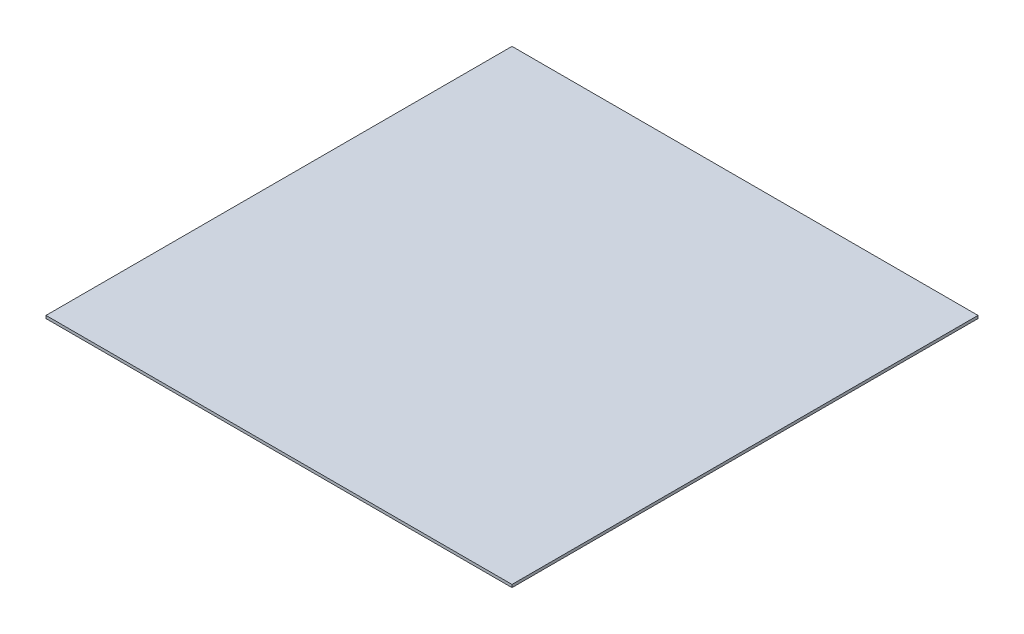
ISO-10303-21;
HEADER;
FILE_DESCRIPTION(('STEP AP214'),'2;1');
FILE_NAME('part.step','',(''),(''),'','','');
FILE_SCHEMA(('AUTOMOTIVE_DESIGN { 1 0 10303 214 1 1 1 1 }'));
ENDSEC;
DATA;
#1=APPLICATION_CONTEXT('core data for automotive mechanical design processes');
#2=APPLICATION_PROTOCOL_DEFINITION('international standard','automotive_design',2000,#1);
#3=PRODUCT_CONTEXT('',#1,'mechanical');
#4=PRODUCT('Part','Part','',(#3));
#5=PRODUCT_RELATED_PRODUCT_CATEGORY('part','',(#4));
#6=PRODUCT_DEFINITION_FORMATION('','',#4);
#7=PRODUCT_DEFINITION_CONTEXT('part definition',#1,'design');
#8=PRODUCT_DEFINITION('design','',#6,#7);
#9=PRODUCT_DEFINITION_SHAPE('','',#8);
#10=(LENGTH_UNIT() NAMED_UNIT(*) SI_UNIT(.MILLI.,.METRE.));
#11=(NAMED_UNIT(*) PLANE_ANGLE_UNIT() SI_UNIT($,.RADIAN.));
#12=(NAMED_UNIT(*) SI_UNIT($,.STERADIAN.) SOLID_ANGLE_UNIT());
#13=UNCERTAINTY_MEASURE_WITH_UNIT(LENGTH_MEASURE(1.E-05),#10,'distance_accuracy_value','');
#14=(GEOMETRIC_REPRESENTATION_CONTEXT(3) GLOBAL_UNCERTAINTY_ASSIGNED_CONTEXT((#13)) GLOBAL_UNIT_ASSIGNED_CONTEXT((#10,
#11,#12)) REPRESENTATION_CONTEXT('',''));
#15=CARTESIAN_POINT('',(0.,0.,0.));
#16=DIRECTION('',(0.,0.,1.));
#17=DIRECTION('',(1.,0.,0.));
#18=AXIS2_PLACEMENT_3D('',#15,#16,#17);
#19=CARTESIAN_POINT('',(0.,2.9972,0.));
#20=DIRECTION('',(1.,0.,0.));
#21=DIRECTION('',(0.,0.,-1.));
#22=AXIS2_PLACEMENT_3D('',#19,#20,#21);
#23=PLANE('',#22);
#24=DIRECTION('',(0.,0.,1.));
#25=VECTOR('',#24,1.);
#26=CARTESIAN_POINT('',(0.,0.,0.));
#27=LINE('',#26,#25);
#28=CARTESIAN_POINT('',(0.,0.,0.));
#29=VERTEX_POINT('',#28);
#30=CARTESIAN_POINT('',(0.,0.,500.));
#31=VERTEX_POINT('',#30);
#32=EDGE_CURVE('E96',#29,#31,#27,.T.);
#33=ORIENTED_EDGE('',*,*,#32,.T.);
#34=DIRECTION('',(0.,-1.,0.));
#35=VECTOR('',#34,1.);
#36=CARTESIAN_POINT('',(0.,2.9972,500.));
#37=LINE('',#36,#35);
#38=CARTESIAN_POINT('',(0.,2.9972,500.));
#39=VERTEX_POINT('',#38);
#40=EDGE_CURVE('E11',#39,#31,#37,.T.);
#41=ORIENTED_EDGE('',*,*,#40,.F.);
#42=DIRECTION('',(0.,0.,1.));
#43=VECTOR('',#42,1.);
#44=CARTESIAN_POINT('',(0.,2.9972,0.));
#45=LINE('',#44,#43);
#46=CARTESIAN_POINT('',(0.,2.9972,0.));
#47=VERTEX_POINT('',#46);
#48=EDGE_CURVE('E84',#47,#39,#45,.T.);
#49=ORIENTED_EDGE('',*,*,#48,.F.);
#50=DIRECTION('',(0.,-1.,0.));
#51=VECTOR('',#50,1.);
#52=CARTESIAN_POINT('',(0.,2.9972,0.));
#53=LINE('',#52,#51);
#54=EDGE_CURVE('E92',#47,#29,#53,.T.);
#55=ORIENTED_EDGE('',*,*,#54,.T.);
#56=EDGE_LOOP('',(#33,#41,#49,#55));
#57=FACE_BOUND('',#56,.T.);
#58=ADVANCED_FACE('F33',(#57),#23,.F.);
#59=CARTESIAN_POINT('',(0.,2.9972,500.));
#60=DIRECTION('',(0.,0.,-1.));
#61=DIRECTION('',(-1.,0.,0.));
#62=AXIS2_PLACEMENT_3D('',#59,#60,#61);
#63=PLANE('',#62);
#64=DIRECTION('',(1.,0.,0.));
#65=VECTOR('',#64,1.);
#66=CARTESIAN_POINT('',(0.,0.,500.));
#67=LINE('',#66,#65);
#68=CARTESIAN_POINT('',(500.,0.,500.));
#69=VERTEX_POINT('',#68);
#70=EDGE_CURVE('E88',#31,#69,#67,.T.);
#71=ORIENTED_EDGE('',*,*,#70,.T.);
#72=DIRECTION('',(0.,-1.,0.));
#73=VECTOR('',#72,1.);
#74=CARTESIAN_POINT('',(500.,2.9972,500.));
#75=LINE('',#74,#73);
#76=CARTESIAN_POINT('',(500.,2.9972,500.));
#77=VERTEX_POINT('',#76);
#78=EDGE_CURVE('E41',#77,#69,#75,.T.);
#79=ORIENTED_EDGE('',*,*,#78,.F.);
#80=DIRECTION('',(1.,0.,0.));
#81=VECTOR('',#80,1.);
#82=CARTESIAN_POINT('',(0.,2.9972,500.));
#83=LINE('',#82,#81);
#84=EDGE_CURVE('E79',#39,#77,#83,.T.);
#85=ORIENTED_EDGE('',*,*,#84,.F.);
#86=ORIENTED_EDGE('',*,*,#40,.T.);
#87=EDGE_LOOP('',(#71,#79,#85,#86));
#88=FACE_BOUND('',#87,.T.);
#89=ADVANCED_FACE('F87',(#88),#63,.F.);
#90=CARTESIAN_POINT('',(500.,2.9972,0.));
#91=DIRECTION('',(-1.,0.,0.));
#92=DIRECTION('',(0.,0.,1.));
#93=AXIS2_PLACEMENT_3D('',#90,#91,#92);
#94=PLANE('',#93);
#95=DIRECTION('',(0.,0.,-1.));
#96=VECTOR('',#95,1.);
#97=CARTESIAN_POINT('',(500.,0.,0.));
#98=LINE('',#97,#96);
#99=CARTESIAN_POINT('',(500.,0.,0.));
#100=VERTEX_POINT('',#99);
#101=EDGE_CURVE('E66',#69,#100,#98,.T.);
#102=ORIENTED_EDGE('',*,*,#101,.T.);
#103=DIRECTION('',(0.,-1.,0.));
#104=VECTOR('',#103,1.);
#105=CARTESIAN_POINT('',(500.,2.9972,0.));
#106=LINE('',#105,#104);
#107=CARTESIAN_POINT('',(500.,2.9972,0.));
#108=VERTEX_POINT('',#107);
#109=EDGE_CURVE('E89',#108,#100,#106,.T.);
#110=ORIENTED_EDGE('',*,*,#109,.F.);
#111=DIRECTION('',(0.,0.,-1.));
#112=VECTOR('',#111,1.);
#113=CARTESIAN_POINT('',(500.,2.9972,0.));
#114=LINE('',#113,#112);
#115=EDGE_CURVE('E82',#77,#108,#114,.T.);
#116=ORIENTED_EDGE('',*,*,#115,.F.);
#117=ORIENTED_EDGE('',*,*,#78,.T.);
#118=EDGE_LOOP('',(#102,#110,#116,#117));
#119=FACE_BOUND('',#118,.T.);
#120=ADVANCED_FACE('F90',(#119),#94,.F.);
#121=CARTESIAN_POINT('',(0.,2.9972,0.));
#122=DIRECTION('',(0.,0.,1.));
#123=DIRECTION('',(1.,0.,0.));
#124=AXIS2_PLACEMENT_3D('',#121,#122,#123);
#125=PLANE('',#124);
#126=DIRECTION('',(-1.,0.,0.));
#127=VECTOR('',#126,1.);
#128=CARTESIAN_POINT('',(0.,0.,0.));
#129=LINE('',#128,#127);
#130=EDGE_CURVE('E72',#100,#29,#129,.T.);
#131=ORIENTED_EDGE('',*,*,#130,.T.);
#132=ORIENTED_EDGE('',*,*,#54,.F.);
#133=DIRECTION('',(-1.,0.,0.));
#134=VECTOR('',#133,1.);
#135=CARTESIAN_POINT('',(0.,2.9972,0.));
#136=LINE('',#135,#134);
#137=EDGE_CURVE('E49',#108,#47,#136,.T.);
#138=ORIENTED_EDGE('',*,*,#137,.F.);
#139=ORIENTED_EDGE('',*,*,#109,.T.);
#140=EDGE_LOOP('',(#131,#132,#138,#139));
#141=FACE_BOUND('',#140,.T.);
#142=ADVANCED_FACE('F103',(#141),#125,.F.);
#143=CARTESIAN_POINT('',(0.,2.9972,0.));
#144=DIRECTION('',(0.,1.,0.));
#145=DIRECTION('',(0.,0.,1.));
#146=AXIS2_PLACEMENT_3D('',#143,#144,#145);
#147=PLANE('',#146);
#148=ORIENTED_EDGE('',*,*,#48,.T.);
#149=ORIENTED_EDGE('',*,*,#84,.T.);
#150=ORIENTED_EDGE('',*,*,#115,.T.);
#151=ORIENTED_EDGE('',*,*,#137,.T.);
#152=EDGE_LOOP('',(#148,#149,#150,#151));
#153=FACE_BOUND('',#152,.T.);
#154=ADVANCED_FACE('F80',(#153),#147,.T.);
#155=CARTESIAN_POINT('',(0.,0.,0.));
#156=DIRECTION('',(0.,1.,0.));
#157=DIRECTION('',(0.,0.,1.));
#158=AXIS2_PLACEMENT_3D('',#155,#156,#157);
#159=PLANE('',#158);
#160=ORIENTED_EDGE('',*,*,#32,.F.);
#161=ORIENTED_EDGE('',*,*,#130,.F.);
#162=ORIENTED_EDGE('',*,*,#101,.F.);
#163=ORIENTED_EDGE('',*,*,#70,.F.);
#164=EDGE_LOOP('',(#160,#161,#162,#163));
#165=FACE_BOUND('',#164,.T.);
#166=ADVANCED_FACE('F106',(#165),#159,.F.);
#167=CLOSED_SHELL('',(#58,#89,#120,#142,#154,#166));
#168=MANIFOLD_SOLID_BREP('B2',#167);
#169=ADVANCED_BREP_SHAPE_REPRESENTATION('',(#18,#168),#14);
#170=SHAPE_DEFINITION_REPRESENTATION(#9,#169);
ENDSEC;
END-ISO-10303-21;
